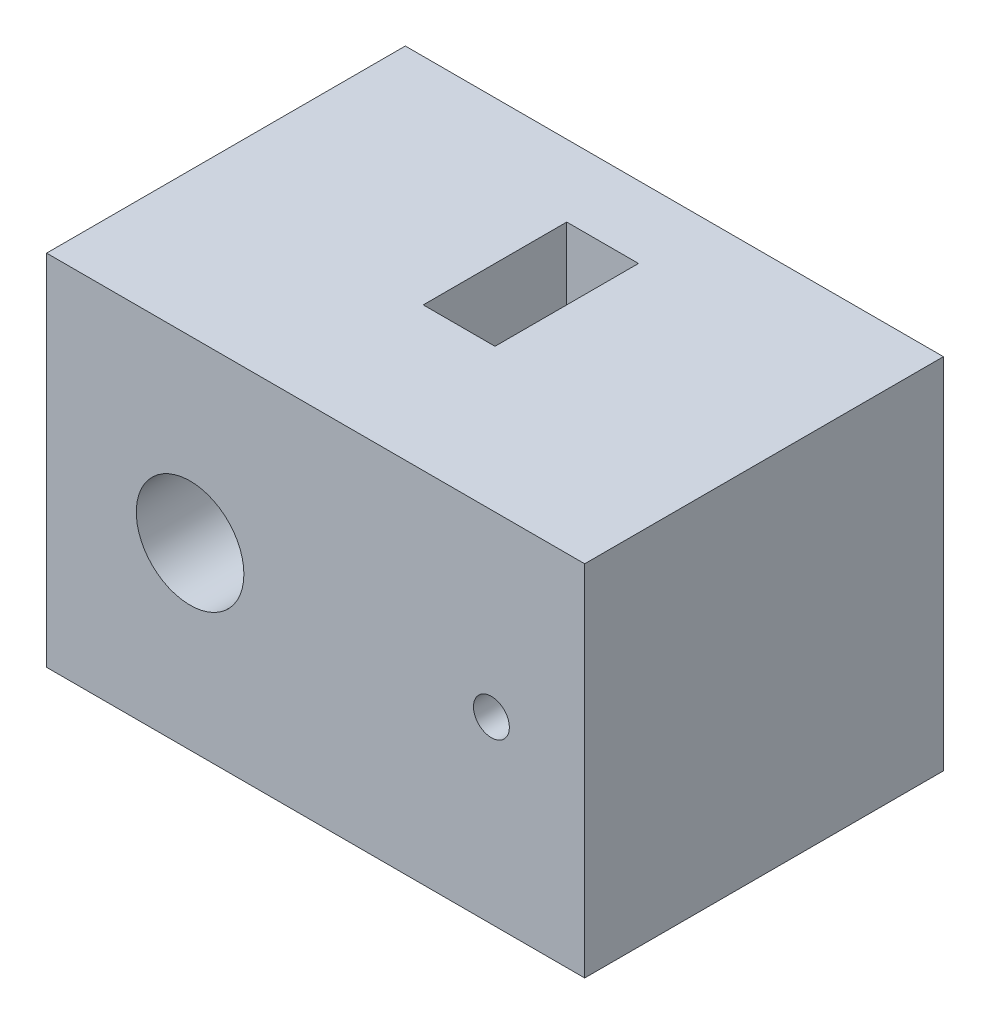
ISO-10303-21;
HEADER;
FILE_DESCRIPTION(('STEP AP214'),'2;1');
FILE_NAME('part.step','',(''),(''),'','','');
FILE_SCHEMA(('AUTOMOTIVE_DESIGN { 1 0 10303 214 1 1 1 1 }'));
ENDSEC;
DATA;
#1=APPLICATION_CONTEXT('core data for automotive mechanical design processes');
#2=APPLICATION_PROTOCOL_DEFINITION('international standard','automotive_design',2000,#1);
#3=PRODUCT_CONTEXT('',#1,'mechanical');
#4=PRODUCT('Part','Part','',(#3));
#5=PRODUCT_RELATED_PRODUCT_CATEGORY('part','',(#4));
#6=PRODUCT_DEFINITION_FORMATION('','',#4);
#7=PRODUCT_DEFINITION_CONTEXT('part definition',#1,'design');
#8=PRODUCT_DEFINITION('design','',#6,#7);
#9=PRODUCT_DEFINITION_SHAPE('','',#8);
#10=(LENGTH_UNIT() NAMED_UNIT(*) SI_UNIT(.MILLI.,.METRE.));
#11=(NAMED_UNIT(*) PLANE_ANGLE_UNIT() SI_UNIT($,.RADIAN.));
#12=(NAMED_UNIT(*) SI_UNIT($,.STERADIAN.) SOLID_ANGLE_UNIT());
#13=UNCERTAINTY_MEASURE_WITH_UNIT(LENGTH_MEASURE(1.E-05),#10,'distance_accuracy_value','');
#14=(GEOMETRIC_REPRESENTATION_CONTEXT(3) GLOBAL_UNCERTAINTY_ASSIGNED_CONTEXT((#13)) GLOBAL_UNIT_ASSIGNED_CONTEXT((#10,
#11,#12)) REPRESENTATION_CONTEXT('',''));
#15=CARTESIAN_POINT('',(0.,0.,0.));
#16=DIRECTION('',(0.,0.,1.));
#17=DIRECTION('',(1.,0.,0.));
#18=AXIS2_PLACEMENT_3D('',#15,#16,#17);
#19=CARTESIAN_POINT('',(0.,0.,50.));
#20=DIRECTION('',(0.,0.,-1.));
#21=DIRECTION('',(-1.,0.,0.));
#22=AXIS2_PLACEMENT_3D('',#19,#20,#21);
#23=PLANE('',#22);
#24=DIRECTION('',(0.,-1.,0.));
#25=VECTOR('',#24,1.);
#26=CARTESIAN_POINT('',(0.,0.,50.));
#27=LINE('',#26,#25);
#28=CARTESIAN_POINT('',(0.,50.,50.));
#29=VERTEX_POINT('',#28);
#30=CARTESIAN_POINT('',(0.,0.,50.));
#31=VERTEX_POINT('',#30);
#32=EDGE_CURVE('E148',#29,#31,#27,.T.);
#33=ORIENTED_EDGE('',*,*,#32,.T.);
#34=DIRECTION('',(1.,0.,0.));
#35=VECTOR('',#34,1.);
#36=CARTESIAN_POINT('',(0.,0.,50.));
#37=LINE('',#36,#35);
#38=CARTESIAN_POINT('',(75.,0.,50.));
#39=VERTEX_POINT('',#38);
#40=EDGE_CURVE('E151',#31,#39,#37,.T.);
#41=ORIENTED_EDGE('',*,*,#40,.T.);
#42=DIRECTION('',(0.,1.,0.));
#43=VECTOR('',#42,1.);
#44=CARTESIAN_POINT('',(75.,0.,50.));
#45=LINE('',#44,#43);
#46=CARTESIAN_POINT('',(75.,50.,50.));
#47=VERTEX_POINT('',#46);
#48=EDGE_CURVE('E154',#39,#47,#45,.T.);
#49=ORIENTED_EDGE('',*,*,#48,.T.);
#50=DIRECTION('',(-1.,0.,0.));
#51=VECTOR('',#50,1.);
#52=CARTESIAN_POINT('',(0.,50.,50.));
#53=LINE('',#52,#51);
#54=EDGE_CURVE('E156',#47,#29,#53,.T.);
#55=ORIENTED_EDGE('',*,*,#54,.T.);
#56=EDGE_LOOP('',(#33,#41,#49,#55));
#57=FACE_BOUND('',#56,.T.);
#58=CARTESIAN_POINT('',(20.,25.,50.));
#59=DIRECTION('',(0.,0.,1.));
#60=DIRECTION('',(1.,0.,0.));
#61=AXIS2_PLACEMENT_3D('',#58,#59,#60);
#62=CIRCLE('',#61,7.5);
#63=CARTESIAN_POINT('',(27.5,25.,50.));
#64=VERTEX_POINT('',#63);
#65=EDGE_CURVE('E142',#64,#64,#62,.T.);
#66=ORIENTED_EDGE('',*,*,#65,.F.);
#67=EDGE_LOOP('',(#66));
#68=FACE_BOUND('',#67,.T.);
#69=CARTESIAN_POINT('',(62.,25.,50.));
#70=DIRECTION('',(0.,0.,1.));
#71=DIRECTION('',(1.,0.,0.));
#72=AXIS2_PLACEMENT_3D('',#69,#70,#71);
#73=CIRCLE('',#72,2.50000000000002);
#74=CARTESIAN_POINT('',(64.5,25.,50.));
#75=VERTEX_POINT('',#74);
#76=EDGE_CURVE('E136',#75,#75,#73,.T.);
#77=ORIENTED_EDGE('',*,*,#76,.F.);
#78=EDGE_LOOP('',(#77));
#79=FACE_BOUND('',#78,.T.);
#80=ADVANCED_FACE('F34',(#57,#68,#79),#23,.F.);
#81=CARTESIAN_POINT('',(0.,0.,0.));
#82=DIRECTION('',(0.,0.,-1.));
#83=DIRECTION('',(-1.,0.,0.));
#84=AXIS2_PLACEMENT_3D('',#81,#82,#83);
#85=PLANE('',#84);
#86=CARTESIAN_POINT('',(20.,25.,0.));
#87=DIRECTION('',(0.,0.,1.));
#88=DIRECTION('',(1.,0.,0.));
#89=AXIS2_PLACEMENT_3D('',#86,#87,#88);
#90=CIRCLE('',#89,7.5);
#91=CARTESIAN_POINT('',(27.5,25.,0.));
#92=VERTEX_POINT('',#91);
#93=EDGE_CURVE('E139',#92,#92,#90,.T.);
#94=ORIENTED_EDGE('',*,*,#93,.T.);
#95=EDGE_LOOP('',(#94));
#96=FACE_BOUND('',#95,.T.);
#97=DIRECTION('',(0.,-1.,0.));
#98=VECTOR('',#97,1.);
#99=CARTESIAN_POINT('',(0.,0.,0.));
#100=LINE('',#99,#98);
#101=CARTESIAN_POINT('',(0.,50.,0.));
#102=VERTEX_POINT('',#101);
#103=CARTESIAN_POINT('',(0.,0.,0.));
#104=VERTEX_POINT('',#103);
#105=EDGE_CURVE('E145',#102,#104,#100,.T.);
#106=ORIENTED_EDGE('',*,*,#105,.F.);
#107=DIRECTION('',(-1.,0.,0.));
#108=VECTOR('',#107,1.);
#109=CARTESIAN_POINT('',(0.,50.,0.));
#110=LINE('',#109,#108);
#111=CARTESIAN_POINT('',(75.,50.,0.));
#112=VERTEX_POINT('',#111);
#113=EDGE_CURVE('E152',#112,#102,#110,.T.);
#114=ORIENTED_EDGE('',*,*,#113,.F.);
#115=DIRECTION('',(0.,1.,0.));
#116=VECTOR('',#115,1.);
#117=CARTESIAN_POINT('',(75.,0.,0.));
#118=LINE('',#117,#116);
#119=CARTESIAN_POINT('',(75.,0.,0.));
#120=VERTEX_POINT('',#119);
#121=EDGE_CURVE('E163',#120,#112,#118,.T.);
#122=ORIENTED_EDGE('',*,*,#121,.F.);
#123=DIRECTION('',(1.,0.,0.));
#124=VECTOR('',#123,1.);
#125=CARTESIAN_POINT('',(0.,0.,0.));
#126=LINE('',#125,#124);
#127=EDGE_CURVE('E161',#104,#120,#126,.T.);
#128=ORIENTED_EDGE('',*,*,#127,.F.);
#129=EDGE_LOOP('',(#106,#114,#122,#128));
#130=FACE_BOUND('',#129,.T.);
#131=CARTESIAN_POINT('',(62.,25.,0.));
#132=DIRECTION('',(0.,0.,1.));
#133=DIRECTION('',(1.,0.,0.));
#134=AXIS2_PLACEMENT_3D('',#131,#132,#133);
#135=CIRCLE('',#134,2.50000000000002);
#136=CARTESIAN_POINT('',(64.5,25.,0.));
#137=VERTEX_POINT('',#136);
#138=EDGE_CURVE('E132',#137,#137,#135,.T.);
#139=ORIENTED_EDGE('',*,*,#138,.T.);
#140=EDGE_LOOP('',(#139));
#141=FACE_BOUND('',#140,.T.);
#142=ADVANCED_FACE('F180',(#96,#130,#141),#85,.T.);
#143=CARTESIAN_POINT('',(0.,0.,50.));
#144=DIRECTION('',(1.,0.,0.));
#145=DIRECTION('',(0.,0.,-1.));
#146=AXIS2_PLACEMENT_3D('',#143,#144,#145);
#147=PLANE('',#146);
#148=ORIENTED_EDGE('',*,*,#105,.T.);
#149=DIRECTION('',(0.,0.,-1.));
#150=VECTOR('',#149,1.);
#151=CARTESIAN_POINT('',(0.,0.,50.));
#152=LINE('',#151,#150);
#153=EDGE_CURVE('E11',#31,#104,#152,.T.);
#154=ORIENTED_EDGE('',*,*,#153,.F.);
#155=ORIENTED_EDGE('',*,*,#32,.F.);
#156=DIRECTION('',(0.,0.,-1.));
#157=VECTOR('',#156,1.);
#158=CARTESIAN_POINT('',(0.,50.,50.));
#159=LINE('',#158,#157);
#160=EDGE_CURVE('E158',#29,#102,#159,.T.);
#161=ORIENTED_EDGE('',*,*,#160,.T.);
#162=EDGE_LOOP('',(#148,#154,#155,#161));
#163=FACE_BOUND('',#162,.T.);
#164=ADVANCED_FACE('F36',(#163),#147,.F.);
#165=CARTESIAN_POINT('',(0.,0.,50.));
#166=DIRECTION('',(0.,1.,0.));
#167=DIRECTION('',(0.,0.,1.));
#168=AXIS2_PLACEMENT_3D('',#165,#166,#167);
#169=PLANE('',#168);
#170=DIRECTION('',(-1.,0.,0.));
#171=VECTOR('',#170,1.);
#172=CARTESIAN_POINT('',(32.5,0.,10.));
#173=LINE('',#172,#171);
#174=CARTESIAN_POINT('',(42.5,0.,10.));
#175=VERTEX_POINT('',#174);
#176=CARTESIAN_POINT('',(32.5,0.,10.));
#177=VERTEX_POINT('',#176);
#178=EDGE_CURVE('E107',#175,#177,#173,.T.);
#179=ORIENTED_EDGE('',*,*,#178,.T.);
#180=DIRECTION('',(0.,0.,1.));
#181=VECTOR('',#180,1.);
#182=CARTESIAN_POINT('',(32.5,0.,10.));
#183=LINE('',#182,#181);
#184=CARTESIAN_POINT('',(32.5,0.,30.));
#185=VERTEX_POINT('',#184);
#186=EDGE_CURVE('E101',#177,#185,#183,.T.);
#187=ORIENTED_EDGE('',*,*,#186,.T.);
#188=DIRECTION('',(1.,0.,0.));
#189=VECTOR('',#188,1.);
#190=CARTESIAN_POINT('',(32.5,0.,30.));
#191=LINE('',#190,#189);
#192=CARTESIAN_POINT('',(42.5,0.,30.));
#193=VERTEX_POINT('',#192);
#194=EDGE_CURVE('E110',#185,#193,#191,.T.);
#195=ORIENTED_EDGE('',*,*,#194,.T.);
#196=DIRECTION('',(0.,0.,-1.));
#197=VECTOR('',#196,1.);
#198=CARTESIAN_POINT('',(42.5,0.,10.));
#199=LINE('',#198,#197);
#200=EDGE_CURVE('E49',#193,#175,#199,.T.);
#201=ORIENTED_EDGE('',*,*,#200,.T.);
#202=EDGE_LOOP('',(#179,#187,#195,#201));
#203=FACE_BOUND('',#202,.T.);
#204=ORIENTED_EDGE('',*,*,#127,.T.);
#205=DIRECTION('',(0.,0.,-1.));
#206=VECTOR('',#205,1.);
#207=CARTESIAN_POINT('',(75.,0.,50.));
#208=LINE('',#207,#206);
#209=EDGE_CURVE('E42',#39,#120,#208,.T.);
#210=ORIENTED_EDGE('',*,*,#209,.F.);
#211=ORIENTED_EDGE('',*,*,#40,.F.);
#212=ORIENTED_EDGE('',*,*,#153,.T.);
#213=EDGE_LOOP('',(#204,#210,#211,#212));
#214=FACE_BOUND('',#213,.T.);
#215=ADVANCED_FACE('F114',(#203,#214),#169,.F.);
#216=CARTESIAN_POINT('',(75.,0.,50.));
#217=DIRECTION('',(-1.,0.,0.));
#218=DIRECTION('',(0.,0.,1.));
#219=AXIS2_PLACEMENT_3D('',#216,#217,#218);
#220=PLANE('',#219);
#221=ORIENTED_EDGE('',*,*,#121,.T.);
#222=DIRECTION('',(0.,0.,-1.));
#223=VECTOR('',#222,1.);
#224=CARTESIAN_POINT('',(75.,50.,50.));
#225=LINE('',#224,#223);
#226=EDGE_CURVE('E168',#47,#112,#225,.T.);
#227=ORIENTED_EDGE('',*,*,#226,.F.);
#228=ORIENTED_EDGE('',*,*,#48,.F.);
#229=ORIENTED_EDGE('',*,*,#209,.T.);
#230=EDGE_LOOP('',(#221,#227,#228,#229));
#231=FACE_BOUND('',#230,.T.);
#232=ADVANCED_FACE('F175',(#231),#220,.F.);
#233=CARTESIAN_POINT('',(0.,50.,50.));
#234=DIRECTION('',(0.,-1.,0.));
#235=DIRECTION('',(0.,0.,-1.));
#236=AXIS2_PLACEMENT_3D('',#233,#234,#235);
#237=PLANE('',#236);
#238=DIRECTION('',(1.,0.,0.));
#239=VECTOR('',#238,1.);
#240=CARTESIAN_POINT('',(32.5,50.,30.));
#241=LINE('',#240,#239);
#242=CARTESIAN_POINT('',(32.5,50.,30.));
#243=VERTEX_POINT('',#242);
#244=CARTESIAN_POINT('',(42.5,50.,30.));
#245=VERTEX_POINT('',#244);
#246=EDGE_CURVE('E126',#243,#245,#241,.T.);
#247=ORIENTED_EDGE('',*,*,#246,.F.);
#248=DIRECTION('',(0.,0.,1.));
#249=VECTOR('',#248,1.);
#250=CARTESIAN_POINT('',(32.5,50.,10.));
#251=LINE('',#250,#249);
#252=CARTESIAN_POINT('',(32.5,50.,10.));
#253=VERTEX_POINT('',#252);
#254=EDGE_CURVE('E57',#253,#243,#251,.T.);
#255=ORIENTED_EDGE('',*,*,#254,.F.);
#256=DIRECTION('',(-1.,0.,0.));
#257=VECTOR('',#256,1.);
#258=CARTESIAN_POINT('',(32.5,50.,10.));
#259=LINE('',#258,#257);
#260=CARTESIAN_POINT('',(42.5,50.,10.));
#261=VERTEX_POINT('',#260);
#262=EDGE_CURVE('E117',#261,#253,#259,.T.);
#263=ORIENTED_EDGE('',*,*,#262,.F.);
#264=DIRECTION('',(0.,0.,-1.));
#265=VECTOR('',#264,1.);
#266=CARTESIAN_POINT('',(42.5,50.,10.));
#267=LINE('',#266,#265);
#268=EDGE_CURVE('E120',#245,#261,#267,.T.);
#269=ORIENTED_EDGE('',*,*,#268,.F.);
#270=EDGE_LOOP('',(#247,#255,#263,#269));
#271=FACE_BOUND('',#270,.T.);
#272=ORIENTED_EDGE('',*,*,#113,.T.);
#273=ORIENTED_EDGE('',*,*,#160,.F.);
#274=ORIENTED_EDGE('',*,*,#54,.F.);
#275=ORIENTED_EDGE('',*,*,#226,.T.);
#276=EDGE_LOOP('',(#272,#273,#274,#275));
#277=FACE_BOUND('',#276,.T.);
#278=ADVANCED_FACE('F184',(#271,#277),#237,.F.);
#279=CARTESIAN_POINT('',(20.,25.,50.));
#280=DIRECTION('',(0.,0.,-1.));
#281=DIRECTION('',(-1.,0.,0.));
#282=AXIS2_PLACEMENT_3D('',#279,#280,#281);
#283=CYLINDRICAL_SURFACE('',#282,7.5);
#284=ORIENTED_EDGE('',*,*,#65,.T.);
#285=EDGE_LOOP('',(#284));
#286=FACE_BOUND('',#285,.T.);
#287=ORIENTED_EDGE('',*,*,#93,.F.);
#288=EDGE_LOOP('',(#287));
#289=FACE_BOUND('',#288,.T.);
#290=ADVANCED_FACE('F205',(#286,#289),#283,.F.);
#291=CARTESIAN_POINT('',(62.,25.,50.));
#292=DIRECTION('',(0.,0.,-1.));
#293=DIRECTION('',(-1.,0.,0.));
#294=AXIS2_PLACEMENT_3D('',#291,#292,#293);
#295=CYLINDRICAL_SURFACE('',#294,2.50000000000002);
#296=ORIENTED_EDGE('',*,*,#76,.T.);
#297=EDGE_LOOP('',(#296));
#298=FACE_BOUND('',#297,.T.);
#299=ORIENTED_EDGE('',*,*,#138,.F.);
#300=EDGE_LOOP('',(#299));
#301=FACE_BOUND('',#300,.T.);
#302=ADVANCED_FACE('F213',(#298,#301),#295,.F.);
#303=CARTESIAN_POINT('',(32.5,0.,10.));
#304=DIRECTION('',(-1.,0.,0.));
#305=DIRECTION('',(0.,0.,1.));
#306=AXIS2_PLACEMENT_3D('',#303,#304,#305);
#307=PLANE('',#306);
#308=ORIENTED_EDGE('',*,*,#254,.T.);
#309=DIRECTION('',(0.,1.,0.));
#310=VECTOR('',#309,1.);
#311=CARTESIAN_POINT('',(32.5,0.,30.));
#312=LINE('',#311,#310);
#313=EDGE_CURVE('E97',#185,#243,#312,.T.);
#314=ORIENTED_EDGE('',*,*,#313,.F.);
#315=ORIENTED_EDGE('',*,*,#186,.F.);
#316=DIRECTION('',(0.,1.,0.));
#317=VECTOR('',#316,1.);
#318=CARTESIAN_POINT('',(32.5,0.,10.));
#319=LINE('',#318,#317);
#320=EDGE_CURVE('E130',#177,#253,#319,.T.);
#321=ORIENTED_EDGE('',*,*,#320,.T.);
#322=EDGE_LOOP('',(#308,#314,#315,#321));
#323=FACE_BOUND('',#322,.T.);
#324=ADVANCED_FACE('F99',(#323),#307,.F.);
#325=CARTESIAN_POINT('',(32.5,0.,10.));
#326=DIRECTION('',(0.,0.,-1.));
#327=DIRECTION('',(-1.,0.,0.));
#328=AXIS2_PLACEMENT_3D('',#325,#326,#327);
#329=PLANE('',#328);
#330=ORIENTED_EDGE('',*,*,#262,.T.);
#331=ORIENTED_EDGE('',*,*,#320,.F.);
#332=ORIENTED_EDGE('',*,*,#178,.F.);
#333=DIRECTION('',(0.,1.,0.));
#334=VECTOR('',#333,1.);
#335=CARTESIAN_POINT('',(42.5,0.,10.));
#336=LINE('',#335,#334);
#337=EDGE_CURVE('E133',#175,#261,#336,.T.);
#338=ORIENTED_EDGE('',*,*,#337,.T.);
#339=EDGE_LOOP('',(#330,#331,#332,#338));
#340=FACE_BOUND('',#339,.T.);
#341=ADVANCED_FACE('F219',(#340),#329,.F.);
#342=CARTESIAN_POINT('',(42.5,0.,10.));
#343=DIRECTION('',(1.,0.,0.));
#344=DIRECTION('',(0.,0.,-1.));
#345=AXIS2_PLACEMENT_3D('',#342,#343,#344);
#346=PLANE('',#345);
#347=ORIENTED_EDGE('',*,*,#268,.T.);
#348=ORIENTED_EDGE('',*,*,#337,.F.);
#349=ORIENTED_EDGE('',*,*,#200,.F.);
#350=DIRECTION('',(0.,1.,0.));
#351=VECTOR('',#350,1.);
#352=CARTESIAN_POINT('',(42.5,0.,30.));
#353=LINE('',#352,#351);
#354=EDGE_CURVE('E106',#193,#245,#353,.T.);
#355=ORIENTED_EDGE('',*,*,#354,.T.);
#356=EDGE_LOOP('',(#347,#348,#349,#355));
#357=FACE_BOUND('',#356,.T.);
#358=ADVANCED_FACE('F217',(#357),#346,.F.);
#359=CARTESIAN_POINT('',(32.5,0.,30.));
#360=DIRECTION('',(0.,0.,1.));
#361=DIRECTION('',(1.,0.,0.));
#362=AXIS2_PLACEMENT_3D('',#359,#360,#361);
#363=PLANE('',#362);
#364=ORIENTED_EDGE('',*,*,#246,.T.);
#365=ORIENTED_EDGE('',*,*,#354,.F.);
#366=ORIENTED_EDGE('',*,*,#194,.F.);
#367=ORIENTED_EDGE('',*,*,#313,.T.);
#368=EDGE_LOOP('',(#364,#365,#366,#367));
#369=FACE_BOUND('',#368,.T.);
#370=ADVANCED_FACE('F111',(#369),#363,.F.);
#371=CLOSED_SHELL('',(#80,#142,#164,#215,#232,#278,#290,#302,#324,#341,#358,#370));
#372=MANIFOLD_SOLID_BREP('B2',#371);
#373=ADVANCED_BREP_SHAPE_REPRESENTATION('',(#18,#372),#14);
#374=SHAPE_DEFINITION_REPRESENTATION(#9,#373);
ENDSEC;
END-ISO-10303-21;
